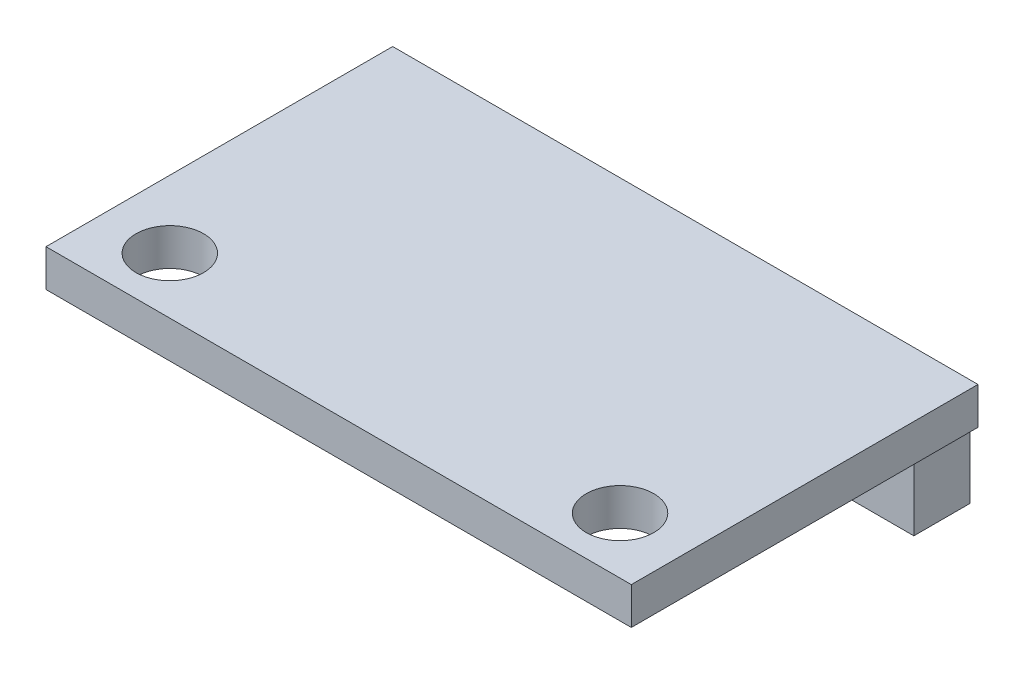
ISO-10303-21;
HEADER;
FILE_DESCRIPTION(('STEP AP214'),'2;1');
FILE_NAME('part.step','',(''),(''),'','','');
FILE_SCHEMA(('AUTOMOTIVE_DESIGN { 1 0 10303 214 1 1 1 1 }'));
ENDSEC;
DATA;
#1=APPLICATION_CONTEXT('core data for automotive mechanical design processes');
#2=APPLICATION_PROTOCOL_DEFINITION('international standard','automotive_design',2000,#1);
#3=PRODUCT_CONTEXT('',#1,'mechanical');
#4=PRODUCT('Part','Part','',(#3));
#5=PRODUCT_RELATED_PRODUCT_CATEGORY('part','',(#4));
#6=PRODUCT_DEFINITION_FORMATION('','',#4);
#7=PRODUCT_DEFINITION_CONTEXT('part definition',#1,'design');
#8=PRODUCT_DEFINITION('design','',#6,#7);
#9=PRODUCT_DEFINITION_SHAPE('','',#8);
#10=(LENGTH_UNIT() NAMED_UNIT(*) SI_UNIT(.MILLI.,.METRE.));
#11=(NAMED_UNIT(*) PLANE_ANGLE_UNIT() SI_UNIT($,.RADIAN.));
#12=(NAMED_UNIT(*) SI_UNIT($,.STERADIAN.) SOLID_ANGLE_UNIT());
#13=UNCERTAINTY_MEASURE_WITH_UNIT(LENGTH_MEASURE(1.E-05),#10,'distance_accuracy_value','');
#14=(GEOMETRIC_REPRESENTATION_CONTEXT(3) GLOBAL_UNCERTAINTY_ASSIGNED_CONTEXT((#13)) GLOBAL_UNIT_ASSIGNED_CONTEXT((#10,
#11,#12)) REPRESENTATION_CONTEXT('',''));
#15=CARTESIAN_POINT('',(0.,0.,0.));
#16=DIRECTION('',(0.,0.,1.));
#17=DIRECTION('',(1.,0.,0.));
#18=AXIS2_PLACEMENT_3D('',#15,#16,#17);
#19=CARTESIAN_POINT('',(0.,0.,0.));
#20=DIRECTION('',(0.,-1.,0.));
#21=DIRECTION('',(0.,0.,-1.));
#22=AXIS2_PLACEMENT_3D('',#19,#20,#21);
#23=PLANE('',#22);
#24=CARTESIAN_POINT('',(-10.,0.,5.2));
#25=DIRECTION('',(0.,1.,0.));
#26=DIRECTION('',(0.,0.,1.));
#27=AXIS2_PLACEMENT_3D('',#24,#25,#26);
#28=CIRCLE('',#27,1.5);
#29=CARTESIAN_POINT('',(-10.,0.,6.7));
#30=VERTEX_POINT('',#29);
#31=EDGE_CURVE('E154',#30,#30,#28,.T.);
#32=ORIENTED_EDGE('',*,*,#31,.T.);
#33=EDGE_LOOP('',(#32));
#34=FACE_BOUND('',#33,.T.);
#35=DIRECTION('',(0.,0.,-1.));
#36=VECTOR('',#35,1.);
#37=CARTESIAN_POINT('',(13.,0.,7.7));
#38=LINE('',#37,#36);
#39=CARTESIAN_POINT('',(13.,0.,7.7));
#40=VERTEX_POINT('',#39);
#41=CARTESIAN_POINT('',(13.,0.,-7.7));
#42=VERTEX_POINT('',#41);
#43=EDGE_CURVE('E160',#40,#42,#38,.T.);
#44=ORIENTED_EDGE('',*,*,#43,.F.);
#45=DIRECTION('',(1.,0.,0.));
#46=VECTOR('',#45,1.);
#47=CARTESIAN_POINT('',(-13.,0.,7.7));
#48=LINE('',#47,#46);
#49=CARTESIAN_POINT('',(-13.,0.,7.7));
#50=VERTEX_POINT('',#49);
#51=EDGE_CURVE('E85',#50,#40,#48,.T.);
#52=ORIENTED_EDGE('',*,*,#51,.F.);
#53=DIRECTION('',(0.,0.,1.));
#54=VECTOR('',#53,1.);
#55=CARTESIAN_POINT('',(-13.,0.,7.7));
#56=LINE('',#55,#54);
#57=CARTESIAN_POINT('',(-13.,0.,-7.7));
#58=VERTEX_POINT('',#57);
#59=EDGE_CURVE('E181',#58,#50,#56,.T.);
#60=ORIENTED_EDGE('',*,*,#59,.F.);
#61=DIRECTION('',(-1.,0.,0.));
#62=VECTOR('',#61,1.);
#63=CARTESIAN_POINT('',(-13.,0.,-7.7));
#64=LINE('',#63,#62);
#65=EDGE_CURVE('E178',#42,#58,#64,.T.);
#66=ORIENTED_EDGE('',*,*,#65,.F.);
#67=EDGE_LOOP('',(#44,#52,#60,#66));
#68=FACE_BOUND('',#67,.T.);
#69=CARTESIAN_POINT('',(10.,0.,5.2));
#70=DIRECTION('',(0.,1.,0.));
#71=DIRECTION('',(0.,0.,1.));
#72=AXIS2_PLACEMENT_3D('',#69,#70,#71);
#73=CIRCLE('',#72,1.5);
#74=CARTESIAN_POINT('',(10.,0.,6.7));
#75=VERTEX_POINT('',#74);
#76=EDGE_CURVE('E142',#75,#75,#73,.T.);
#77=ORIENTED_EDGE('',*,*,#76,.T.);
#78=EDGE_LOOP('',(#77));
#79=FACE_BOUND('',#78,.T.);
#80=DIRECTION('',(1.,0.,0.));
#81=VECTOR('',#80,1.);
#82=CARTESIAN_POINT('',(-12.75,0.,-7.6));
#83=LINE('',#82,#81);
#84=CARTESIAN_POINT('',(-12.75,0.,-7.6));
#85=VERTEX_POINT('',#84);
#86=CARTESIAN_POINT('',(12.75,0.,-7.6));
#87=VERTEX_POINT('',#86);
#88=EDGE_CURVE('E325',#85,#87,#83,.T.);
#89=ORIENTED_EDGE('',*,*,#88,.F.);
#90=DIRECTION('',(0.,0.,-1.));
#91=VECTOR('',#90,1.);
#92=CARTESIAN_POINT('',(-12.75,0.,-5.1));
#93=LINE('',#92,#91);
#94=CARTESIAN_POINT('',(-12.75,0.,-5.1));
#95=VERTEX_POINT('',#94);
#96=EDGE_CURVE('E139',#95,#85,#93,.T.);
#97=ORIENTED_EDGE('',*,*,#96,.F.);
#98=DIRECTION('',(-1.,0.,0.));
#99=VECTOR('',#98,1.);
#100=CARTESIAN_POINT('',(-12.75,0.,-5.1));
#101=LINE('',#100,#99);
#102=CARTESIAN_POINT('',(12.75,0.,-5.1));
#103=VERTEX_POINT('',#102);
#104=EDGE_CURVE('E135',#103,#95,#101,.T.);
#105=ORIENTED_EDGE('',*,*,#104,.F.);
#106=DIRECTION('',(0.,0.,1.));
#107=VECTOR('',#106,1.);
#108=CARTESIAN_POINT('',(12.75,0.,-5.1));
#109=LINE('',#108,#107);
#110=EDGE_CURVE('E321',#87,#103,#109,.T.);
#111=ORIENTED_EDGE('',*,*,#110,.F.);
#112=EDGE_LOOP('',(#89,#97,#105,#111));
#113=FACE_BOUND('',#112,.T.);
#114=ADVANCED_FACE('F39',(#34,#68,#79,#113),#23,.T.);
#115=CARTESIAN_POINT('',(0.,1.65,0.));
#116=DIRECTION('',(0.,-1.,0.));
#117=DIRECTION('',(0.,0.,-1.));
#118=AXIS2_PLACEMENT_3D('',#115,#116,#117);
#119=PLANE('',#118);
#120=DIRECTION('',(0.,0.,-1.));
#121=VECTOR('',#120,1.);
#122=CARTESIAN_POINT('',(13.,1.65,7.7));
#123=LINE('',#122,#121);
#124=CARTESIAN_POINT('',(13.,1.65,7.7));
#125=VERTEX_POINT('',#124);
#126=CARTESIAN_POINT('',(13.,1.65,-7.7));
#127=VERTEX_POINT('',#126);
#128=EDGE_CURVE('E164',#125,#127,#123,.T.);
#129=ORIENTED_EDGE('',*,*,#128,.T.);
#130=DIRECTION('',(-1.,0.,0.));
#131=VECTOR('',#130,1.);
#132=CARTESIAN_POINT('',(-13.,1.65,-7.7));
#133=LINE('',#132,#131);
#134=CARTESIAN_POINT('',(-13.,1.65,-7.7));
#135=VERTEX_POINT('',#134);
#136=EDGE_CURVE('E92',#127,#135,#133,.T.);
#137=ORIENTED_EDGE('',*,*,#136,.T.);
#138=DIRECTION('',(0.,0.,1.));
#139=VECTOR('',#138,1.);
#140=CARTESIAN_POINT('',(-13.,1.65,7.7));
#141=LINE('',#140,#139);
#142=CARTESIAN_POINT('',(-13.,1.65,7.7));
#143=VERTEX_POINT('',#142);
#144=EDGE_CURVE('E169',#135,#143,#141,.T.);
#145=ORIENTED_EDGE('',*,*,#144,.T.);
#146=DIRECTION('',(1.,0.,0.));
#147=VECTOR('',#146,1.);
#148=CARTESIAN_POINT('',(-13.,1.65,7.7));
#149=LINE('',#148,#147);
#150=EDGE_CURVE('E64',#143,#125,#149,.T.);
#151=ORIENTED_EDGE('',*,*,#150,.T.);
#152=EDGE_LOOP('',(#129,#137,#145,#151));
#153=FACE_BOUND('',#152,.T.);
#154=CARTESIAN_POINT('',(-10.,1.65,5.2));
#155=DIRECTION('',(0.,1.,0.));
#156=DIRECTION('',(0.,0.,1.));
#157=AXIS2_PLACEMENT_3D('',#154,#155,#156);
#158=CIRCLE('',#157,1.5);
#159=CARTESIAN_POINT('',(-10.,1.65,6.7));
#160=VERTEX_POINT('',#159);
#161=EDGE_CURVE('E156',#160,#160,#158,.T.);
#162=ORIENTED_EDGE('',*,*,#161,.F.);
#163=EDGE_LOOP('',(#162));
#164=FACE_BOUND('',#163,.T.);
#165=CARTESIAN_POINT('',(10.,1.65,5.2));
#166=DIRECTION('',(0.,1.,0.));
#167=DIRECTION('',(0.,0.,1.));
#168=AXIS2_PLACEMENT_3D('',#165,#166,#167);
#169=CIRCLE('',#168,1.5);
#170=CARTESIAN_POINT('',(10.,1.65,6.7));
#171=VERTEX_POINT('',#170);
#172=EDGE_CURVE('E147',#171,#171,#169,.T.);
#173=ORIENTED_EDGE('',*,*,#172,.F.);
#174=EDGE_LOOP('',(#173));
#175=FACE_BOUND('',#174,.T.);
#176=ADVANCED_FACE('F218',(#153,#164,#175),#119,.F.);
#177=CARTESIAN_POINT('',(13.,1.65,7.7));
#178=DIRECTION('',(-1.,0.,0.));
#179=DIRECTION('',(0.,0.,1.));
#180=AXIS2_PLACEMENT_3D('',#177,#178,#179);
#181=PLANE('',#180);
#182=ORIENTED_EDGE('',*,*,#43,.T.);
#183=DIRECTION('',(0.,-1.,0.));
#184=VECTOR('',#183,1.);
#185=CARTESIAN_POINT('',(13.,1.65,-7.7));
#186=LINE('',#185,#184);
#187=EDGE_CURVE('E11',#127,#42,#186,.T.);
#188=ORIENTED_EDGE('',*,*,#187,.F.);
#189=ORIENTED_EDGE('',*,*,#128,.F.);
#190=DIRECTION('',(0.,-1.,0.));
#191=VECTOR('',#190,1.);
#192=CARTESIAN_POINT('',(13.,1.65,7.7));
#193=LINE('',#192,#191);
#194=EDGE_CURVE('E174',#125,#40,#193,.T.);
#195=ORIENTED_EDGE('',*,*,#194,.T.);
#196=EDGE_LOOP('',(#182,#188,#189,#195));
#197=FACE_BOUND('',#196,.T.);
#198=ADVANCED_FACE('F41',(#197),#181,.F.);
#199=CARTESIAN_POINT('',(-13.,1.65,-7.7));
#200=DIRECTION('',(0.,0.,1.));
#201=DIRECTION('',(1.,0.,0.));
#202=AXIS2_PLACEMENT_3D('',#199,#200,#201);
#203=PLANE('',#202);
#204=ORIENTED_EDGE('',*,*,#65,.T.);
#205=DIRECTION('',(0.,-1.,0.));
#206=VECTOR('',#205,1.);
#207=CARTESIAN_POINT('',(-13.,1.65,-7.7));
#208=LINE('',#207,#206);
#209=EDGE_CURVE('E48',#135,#58,#208,.T.);
#210=ORIENTED_EDGE('',*,*,#209,.F.);
#211=ORIENTED_EDGE('',*,*,#136,.F.);
#212=ORIENTED_EDGE('',*,*,#187,.T.);
#213=EDGE_LOOP('',(#204,#210,#211,#212));
#214=FACE_BOUND('',#213,.T.);
#215=ADVANCED_FACE('F214',(#214),#203,.F.);
#216=CARTESIAN_POINT('',(-13.,1.65,7.7));
#217=DIRECTION('',(1.,0.,0.));
#218=DIRECTION('',(0.,0.,-1.));
#219=AXIS2_PLACEMENT_3D('',#216,#217,#218);
#220=PLANE('',#219);
#221=ORIENTED_EDGE('',*,*,#59,.T.);
#222=DIRECTION('',(0.,-1.,0.));
#223=VECTOR('',#222,1.);
#224=CARTESIAN_POINT('',(-13.,1.65,7.7));
#225=LINE('',#224,#223);
#226=EDGE_CURVE('E188',#143,#50,#225,.T.);
#227=ORIENTED_EDGE('',*,*,#226,.F.);
#228=ORIENTED_EDGE('',*,*,#144,.F.);
#229=ORIENTED_EDGE('',*,*,#209,.T.);
#230=EDGE_LOOP('',(#221,#227,#228,#229));
#231=FACE_BOUND('',#230,.T.);
#232=ADVANCED_FACE('F195',(#231),#220,.F.);
#233=CARTESIAN_POINT('',(-13.,1.65,7.7));
#234=DIRECTION('',(0.,0.,-1.));
#235=DIRECTION('',(-1.,0.,0.));
#236=AXIS2_PLACEMENT_3D('',#233,#234,#235);
#237=PLANE('',#236);
#238=ORIENTED_EDGE('',*,*,#51,.T.);
#239=ORIENTED_EDGE('',*,*,#194,.F.);
#240=ORIENTED_EDGE('',*,*,#150,.F.);
#241=ORIENTED_EDGE('',*,*,#226,.T.);
#242=EDGE_LOOP('',(#238,#239,#240,#241));
#243=FACE_BOUND('',#242,.T.);
#244=ADVANCED_FACE('F203',(#243),#237,.F.);
#245=CARTESIAN_POINT('',(-10.,1.65,5.2));
#246=DIRECTION('',(0.,-1.,0.));
#247=DIRECTION('',(0.,0.,-1.));
#248=AXIS2_PLACEMENT_3D('',#245,#246,#247);
#249=CYLINDRICAL_SURFACE('',#248,1.5);
#250=ORIENTED_EDGE('',*,*,#161,.T.);
#251=EDGE_LOOP('',(#250));
#252=FACE_BOUND('',#251,.T.);
#253=ORIENTED_EDGE('',*,*,#31,.F.);
#254=EDGE_LOOP('',(#253));
#255=FACE_BOUND('',#254,.T.);
#256=ADVANCED_FACE('F205',(#252,#255),#249,.F.);
#257=CARTESIAN_POINT('',(10.,1.65,5.2));
#258=DIRECTION('',(0.,-1.,0.));
#259=DIRECTION('',(0.,0.,-1.));
#260=AXIS2_PLACEMENT_3D('',#257,#258,#259);
#261=CYLINDRICAL_SURFACE('',#260,1.5);
#262=ORIENTED_EDGE('',*,*,#172,.T.);
#263=EDGE_LOOP('',(#262));
#264=FACE_BOUND('',#263,.T.);
#265=ORIENTED_EDGE('',*,*,#76,.F.);
#266=EDGE_LOOP('',(#265));
#267=FACE_BOUND('',#266,.T.);
#268=ADVANCED_FACE('F211',(#264,#267),#261,.F.);
#269=CARTESIAN_POINT('',(-12.75,-3.,-5.1));
#270=DIRECTION('',(1.,0.,0.));
#271=DIRECTION('',(0.,0.,-1.));
#272=AXIS2_PLACEMENT_3D('',#269,#270,#271);
#273=PLANE('',#272);
#274=ORIENTED_EDGE('',*,*,#96,.T.);
#275=DIRECTION('',(0.,1.,0.));
#276=VECTOR('',#275,1.);
#277=CARTESIAN_POINT('',(-12.75,-3.,-7.6));
#278=LINE('',#277,#276);
#279=CARTESIAN_POINT('',(-12.75,-3.,-7.6));
#280=VERTEX_POINT('',#279);
#281=EDGE_CURVE('E118',#280,#85,#278,.T.);
#282=ORIENTED_EDGE('',*,*,#281,.F.);
#283=DIRECTION('',(0.,0.,-1.));
#284=VECTOR('',#283,1.);
#285=CARTESIAN_POINT('',(-12.75,-3.,-5.1));
#286=LINE('',#285,#284);
#287=CARTESIAN_POINT('',(-12.75,-3.,-5.1));
#288=VERTEX_POINT('',#287);
#289=EDGE_CURVE('E126',#288,#280,#286,.T.);
#290=ORIENTED_EDGE('',*,*,#289,.F.);
#291=DIRECTION('',(0.,1.,0.));
#292=VECTOR('',#291,1.);
#293=CARTESIAN_POINT('',(-12.75,-3.,-5.1));
#294=LINE('',#293,#292);
#295=EDGE_CURVE('E317',#288,#95,#294,.T.);
#296=ORIENTED_EDGE('',*,*,#295,.T.);
#297=EDGE_LOOP('',(#274,#282,#290,#296));
#298=FACE_BOUND('',#297,.T.);
#299=ADVANCED_FACE('F137',(#298),#273,.F.);
#300=CARTESIAN_POINT('',(-12.75,-3.,-7.6));
#301=DIRECTION('',(0.,0.,1.));
#302=DIRECTION('',(1.,0.,0.));
#303=AXIS2_PLACEMENT_3D('',#300,#301,#302);
#304=PLANE('',#303);
#305=ORIENTED_EDGE('',*,*,#88,.T.);
#306=DIRECTION('',(0.,1.,0.));
#307=VECTOR('',#306,1.);
#308=CARTESIAN_POINT('',(12.75,-3.,-7.6));
#309=LINE('',#308,#307);
#310=CARTESIAN_POINT('',(12.75,-3.,-7.6));
#311=VERTEX_POINT('',#310);
#312=EDGE_CURVE('E121',#311,#87,#309,.T.);
#313=ORIENTED_EDGE('',*,*,#312,.F.);
#314=DIRECTION('',(1.,0.,0.));
#315=VECTOR('',#314,1.);
#316=CARTESIAN_POINT('',(-12.75,-3.,-7.6));
#317=LINE('',#316,#315);
#318=EDGE_CURVE('E114',#280,#311,#317,.T.);
#319=ORIENTED_EDGE('',*,*,#318,.F.);
#320=ORIENTED_EDGE('',*,*,#281,.T.);
#321=EDGE_LOOP('',(#305,#313,#319,#320));
#322=FACE_BOUND('',#321,.T.);
#323=ADVANCED_FACE('F116',(#322),#304,.F.);
#324=CARTESIAN_POINT('',(12.75,-3.,-5.1));
#325=DIRECTION('',(-1.,0.,0.));
#326=DIRECTION('',(0.,0.,1.));
#327=AXIS2_PLACEMENT_3D('',#324,#325,#326);
#328=PLANE('',#327);
#329=ORIENTED_EDGE('',*,*,#110,.T.);
#330=DIRECTION('',(0.,1.,0.));
#331=VECTOR('',#330,1.);
#332=CARTESIAN_POINT('',(12.75,-3.,-5.1));
#333=LINE('',#332,#331);
#334=CARTESIAN_POINT('',(12.75,-3.,-5.1));
#335=VERTEX_POINT('',#334);
#336=EDGE_CURVE('E55',#335,#103,#333,.T.);
#337=ORIENTED_EDGE('',*,*,#336,.F.);
#338=DIRECTION('',(0.,0.,1.));
#339=VECTOR('',#338,1.);
#340=CARTESIAN_POINT('',(12.75,-3.,-5.1));
#341=LINE('',#340,#339);
#342=EDGE_CURVE('E125',#311,#335,#341,.T.);
#343=ORIENTED_EDGE('',*,*,#342,.F.);
#344=ORIENTED_EDGE('',*,*,#312,.T.);
#345=EDGE_LOOP('',(#329,#337,#343,#344));
#346=FACE_BOUND('',#345,.T.);
#347=ADVANCED_FACE('F232',(#346),#328,.F.);
#348=CARTESIAN_POINT('',(-12.75,-3.,-5.1));
#349=DIRECTION('',(0.,0.,-1.));
#350=DIRECTION('',(-1.,0.,0.));
#351=AXIS2_PLACEMENT_3D('',#348,#349,#350);
#352=PLANE('',#351);
#353=ORIENTED_EDGE('',*,*,#104,.T.);
#354=ORIENTED_EDGE('',*,*,#295,.F.);
#355=DIRECTION('',(-1.,0.,0.));
#356=VECTOR('',#355,1.);
#357=CARTESIAN_POINT('',(-12.75,-3.,-5.1));
#358=LINE('',#357,#356);
#359=EDGE_CURVE('E130',#335,#288,#358,.T.);
#360=ORIENTED_EDGE('',*,*,#359,.F.);
#361=ORIENTED_EDGE('',*,*,#336,.T.);
#362=EDGE_LOOP('',(#353,#354,#360,#361));
#363=FACE_BOUND('',#362,.T.);
#364=ADVANCED_FACE('F235',(#363),#352,.F.);
#365=CARTESIAN_POINT('',(0.,-3.,0.));
#366=DIRECTION('',(0.,-1.,0.));
#367=DIRECTION('',(0.,0.,-1.));
#368=AXIS2_PLACEMENT_3D('',#365,#366,#367);
#369=PLANE('',#368);
#370=ORIENTED_EDGE('',*,*,#289,.T.);
#371=ORIENTED_EDGE('',*,*,#318,.T.);
#372=ORIENTED_EDGE('',*,*,#342,.T.);
#373=ORIENTED_EDGE('',*,*,#359,.T.);
#374=EDGE_LOOP('',(#370,#371,#372,#373));
#375=FACE_BOUND('',#374,.T.);
#376=ADVANCED_FACE('F129',(#375),#369,.T.);
#377=CLOSED_SHELL('',(#114,#176,#198,#215,#232,#244,#256,#268,#299,#323,#347,#364,#376));
#378=MANIFOLD_SOLID_BREP('B2',#377);
#379=ADVANCED_BREP_SHAPE_REPRESENTATION('',(#18,#378),#14);
#380=SHAPE_DEFINITION_REPRESENTATION(#9,#379);
ENDSEC;
END-ISO-10303-21;
